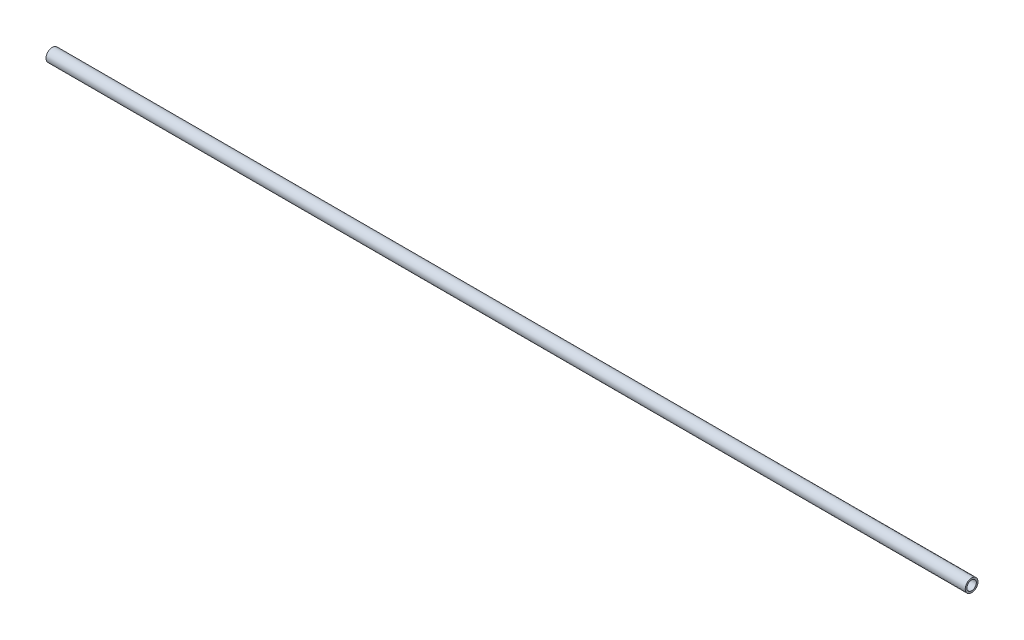
ISO-10303-21;
HEADER;
FILE_DESCRIPTION(('STEP AP214'),'2;1');
FILE_NAME('part.step','',(''),(''),'','','');
FILE_SCHEMA(('AUTOMOTIVE_DESIGN { 1 0 10303 214 1 1 1 1 }'));
ENDSEC;
DATA;
#1=APPLICATION_CONTEXT('core data for automotive mechanical design processes');
#2=APPLICATION_PROTOCOL_DEFINITION('international standard','automotive_design',2000,#1);
#3=PRODUCT_CONTEXT('',#1,'mechanical');
#4=PRODUCT('Part','Part','',(#3));
#5=PRODUCT_RELATED_PRODUCT_CATEGORY('part','',(#4));
#6=PRODUCT_DEFINITION_FORMATION('','',#4);
#7=PRODUCT_DEFINITION_CONTEXT('part definition',#1,'design');
#8=PRODUCT_DEFINITION('design','',#6,#7);
#9=PRODUCT_DEFINITION_SHAPE('','',#8);
#10=(LENGTH_UNIT() NAMED_UNIT(*) SI_UNIT(.MILLI.,.METRE.));
#11=(NAMED_UNIT(*) PLANE_ANGLE_UNIT() SI_UNIT($,.RADIAN.));
#12=(NAMED_UNIT(*) SI_UNIT($,.STERADIAN.) SOLID_ANGLE_UNIT());
#13=UNCERTAINTY_MEASURE_WITH_UNIT(LENGTH_MEASURE(1.E-05),#10,'distance_accuracy_value','');
#14=(GEOMETRIC_REPRESENTATION_CONTEXT(3) GLOBAL_UNCERTAINTY_ASSIGNED_CONTEXT((#13)) GLOBAL_UNIT_ASSIGNED_CONTEXT((#10,
#11,#12)) REPRESENTATION_CONTEXT('',''));
#15=CARTESIAN_POINT('',(0.,0.,0.));
#16=DIRECTION('',(0.,0.,1.));
#17=DIRECTION('',(1.,0.,0.));
#18=AXIS2_PLACEMENT_3D('',#15,#16,#17);
#19=CARTESIAN_POINT('',(457.2,0.,0.));
#20=DIRECTION('',(1.,0.,0.));
#21=DIRECTION('',(0.,0.,-1.));
#22=AXIS2_PLACEMENT_3D('',#19,#20,#21);
#23=PLANE('',#22);
#24=CARTESIAN_POINT('',(457.2,0.,0.));
#25=DIRECTION('',(1.,0.,0.));
#26=DIRECTION('',(0.,0.,-1.));
#27=AXIS2_PLACEMENT_3D('',#24,#25,#26);
#28=CIRCLE('',#27,6.35);
#29=CARTESIAN_POINT('',(457.2,0.,-6.35));
#30=VERTEX_POINT('',#29);
#31=EDGE_CURVE('E10',#30,#30,#28,.T.);
#32=ORIENTED_EDGE('',*,*,#31,.T.);
#33=EDGE_LOOP('',(#32));
#34=FACE_BOUND('',#33,.T.);
#35=CARTESIAN_POINT('',(457.2,0.,0.));
#36=DIRECTION('',(1.,0.,0.));
#37=DIRECTION('',(0.,0.,-1.));
#38=AXIS2_PLACEMENT_3D('',#35,#36,#37);
#39=CIRCLE('',#38,4.699);
#40=CARTESIAN_POINT('',(457.2,0.,-4.699));
#41=VERTEX_POINT('',#40);
#42=EDGE_CURVE('E43',#41,#41,#39,.T.);
#43=ORIENTED_EDGE('',*,*,#42,.F.);
#44=EDGE_LOOP('',(#43));
#45=FACE_BOUND('',#44,.T.);
#46=ADVANCED_FACE('F32',(#34,#45),#23,.T.);
#47=CARTESIAN_POINT('',(-457.2,0.,0.));
#48=DIRECTION('',(1.,0.,0.));
#49=DIRECTION('',(0.,0.,-1.));
#50=AXIS2_PLACEMENT_3D('',#47,#48,#49);
#51=PLANE('',#50);
#52=CARTESIAN_POINT('',(-457.2,0.,0.));
#53=DIRECTION('',(1.,0.,0.));
#54=DIRECTION('',(0.,0.,-1.));
#55=AXIS2_PLACEMENT_3D('',#52,#53,#54);
#56=CIRCLE('',#55,6.35);
#57=CARTESIAN_POINT('',(-457.2,0.,-6.35));
#58=VERTEX_POINT('',#57);
#59=EDGE_CURVE('E36',#58,#58,#56,.T.);
#60=ORIENTED_EDGE('',*,*,#59,.F.);
#61=EDGE_LOOP('',(#60));
#62=FACE_BOUND('',#61,.T.);
#63=CARTESIAN_POINT('',(-457.2,0.,0.));
#64=DIRECTION('',(1.,0.,0.));
#65=DIRECTION('',(0.,0.,-1.));
#66=AXIS2_PLACEMENT_3D('',#63,#64,#65);
#67=CIRCLE('',#66,4.699);
#68=CARTESIAN_POINT('',(-457.2,0.,-4.699));
#69=VERTEX_POINT('',#68);
#70=EDGE_CURVE('E45',#69,#69,#67,.T.);
#71=ORIENTED_EDGE('',*,*,#70,.T.);
#72=EDGE_LOOP('',(#71));
#73=FACE_BOUND('',#72,.T.);
#74=ADVANCED_FACE('F55',(#62,#73),#51,.F.);
#75=CARTESIAN_POINT('',(457.2,0.,0.));
#76=DIRECTION('',(-1.,0.,0.));
#77=DIRECTION('',(0.,0.,1.));
#78=AXIS2_PLACEMENT_3D('',#75,#76,#77);
#79=CYLINDRICAL_SURFACE('',#78,6.35);
#80=ORIENTED_EDGE('',*,*,#31,.F.);
#81=EDGE_LOOP('',(#80));
#82=FACE_BOUND('',#81,.T.);
#83=ORIENTED_EDGE('',*,*,#59,.T.);
#84=EDGE_LOOP('',(#83));
#85=FACE_BOUND('',#84,.T.);
#86=ADVANCED_FACE('F34',(#82,#85),#79,.T.);
#87=CARTESIAN_POINT('',(457.2,0.,0.));
#88=DIRECTION('',(-1.,0.,0.));
#89=DIRECTION('',(0.,0.,1.));
#90=AXIS2_PLACEMENT_3D('',#87,#88,#89);
#91=CYLINDRICAL_SURFACE('',#90,4.699);
#92=ORIENTED_EDGE('',*,*,#42,.T.);
#93=EDGE_LOOP('',(#92));
#94=FACE_BOUND('',#93,.T.);
#95=ORIENTED_EDGE('',*,*,#70,.F.);
#96=EDGE_LOOP('',(#95));
#97=FACE_BOUND('',#96,.T.);
#98=ADVANCED_FACE('F51',(#94,#97),#91,.F.);
#99=CLOSED_SHELL('',(#46,#74,#86,#98));
#100=MANIFOLD_SOLID_BREP('B2',#99);
#101=ADVANCED_BREP_SHAPE_REPRESENTATION('',(#18,#100),#14);
#102=SHAPE_DEFINITION_REPRESENTATION(#9,#101);
ENDSEC;
END-ISO-10303-21;
